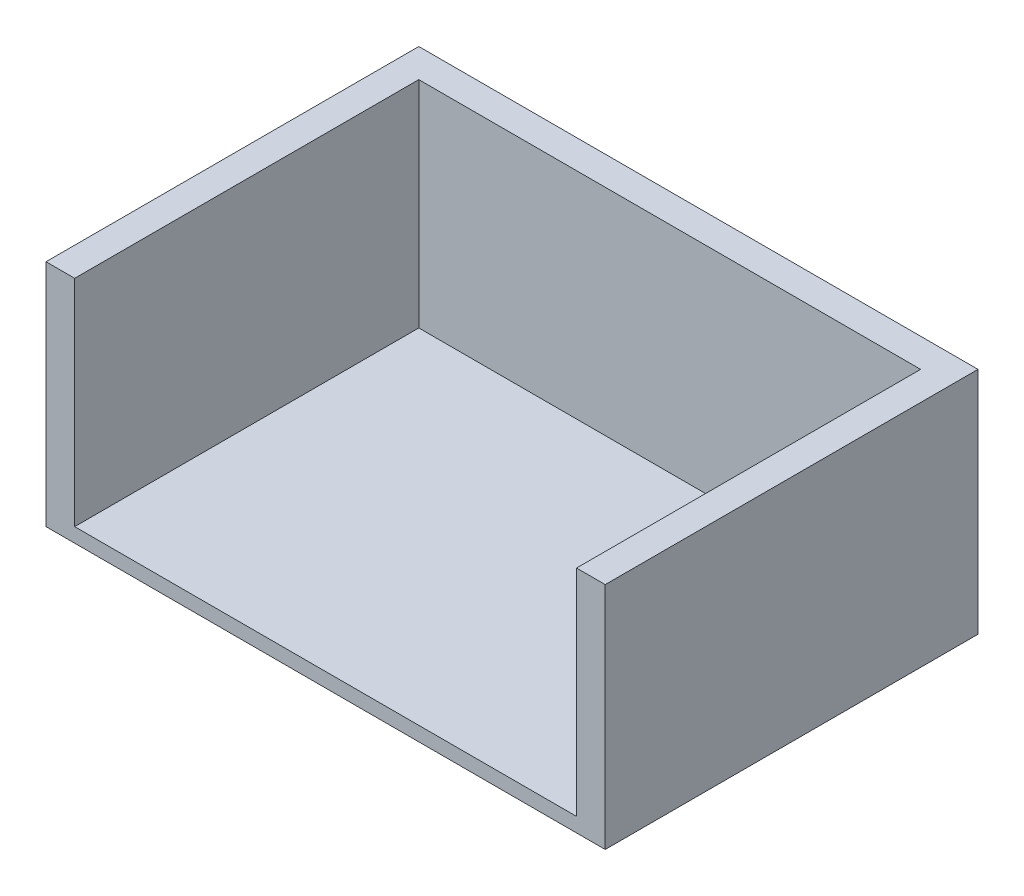
ISO-10303-21;
HEADER;
FILE_DESCRIPTION(('STEP AP214'),'2;1');
FILE_NAME('part.step','',(''),(''),'','','');
FILE_SCHEMA(('AUTOMOTIVE_DESIGN { 1 0 10303 214 1 1 1 1 }'));
ENDSEC;
DATA;
#1=APPLICATION_CONTEXT('core data for automotive mechanical design processes');
#2=APPLICATION_PROTOCOL_DEFINITION('international standard','automotive_design',2000,#1);
#3=PRODUCT_CONTEXT('',#1,'mechanical');
#4=PRODUCT('Part','Part','',(#3));
#5=PRODUCT_RELATED_PRODUCT_CATEGORY('part','',(#4));
#6=PRODUCT_DEFINITION_FORMATION('','',#4);
#7=PRODUCT_DEFINITION_CONTEXT('part definition',#1,'design');
#8=PRODUCT_DEFINITION('design','',#6,#7);
#9=PRODUCT_DEFINITION_SHAPE('','',#8);
#10=(LENGTH_UNIT() NAMED_UNIT(*) SI_UNIT(.MILLI.,.METRE.));
#11=(NAMED_UNIT(*) PLANE_ANGLE_UNIT() SI_UNIT($,.RADIAN.));
#12=(NAMED_UNIT(*) SI_UNIT($,.STERADIAN.) SOLID_ANGLE_UNIT());
#13=UNCERTAINTY_MEASURE_WITH_UNIT(LENGTH_MEASURE(1.E-05),#10,'distance_accuracy_value','');
#14=(GEOMETRIC_REPRESENTATION_CONTEXT(3) GLOBAL_UNCERTAINTY_ASSIGNED_CONTEXT((#13)) GLOBAL_UNIT_ASSIGNED_CONTEXT((#10,
#11,#12)) REPRESENTATION_CONTEXT('',''));
#15=CARTESIAN_POINT('',(0.,0.,0.));
#16=DIRECTION('',(0.,0.,1.));
#17=DIRECTION('',(1.,0.,0.));
#18=AXIS2_PLACEMENT_3D('',#15,#16,#17);
#19=CARTESIAN_POINT('',(175.,150.,0.));
#20=DIRECTION('',(1.,0.,0.));
#21=DIRECTION('',(0.,0.,-1.));
#22=AXIS2_PLACEMENT_3D('',#19,#20,#21);
#23=PLANE('',#22);
#24=DIRECTION('',(0.,0.,1.));
#25=VECTOR('',#24,1.);
#26=CARTESIAN_POINT('',(175.,0.,0.));
#27=LINE('',#26,#25);
#28=CARTESIAN_POINT('',(175.,0.,-120.));
#29=VERTEX_POINT('',#28);
#30=CARTESIAN_POINT('',(175.,0.,120.));
#31=VERTEX_POINT('',#30);
#32=EDGE_CURVE('E122',#29,#31,#27,.T.);
#33=ORIENTED_EDGE('',*,*,#32,.T.);
#34=DIRECTION('',(0.,-1.,0.));
#35=VECTOR('',#34,1.);
#36=CARTESIAN_POINT('',(175.,150.,120.));
#37=LINE('',#36,#35);
#38=CARTESIAN_POINT('',(175.,150.,120.));
#39=VERTEX_POINT('',#38);
#40=EDGE_CURVE('E11',#39,#31,#37,.T.);
#41=ORIENTED_EDGE('',*,*,#40,.F.);
#42=DIRECTION('',(0.,0.,1.));
#43=VECTOR('',#42,1.);
#44=CARTESIAN_POINT('',(175.,150.,0.));
#45=LINE('',#44,#43);
#46=CARTESIAN_POINT('',(175.,150.,-120.));
#47=VERTEX_POINT('',#46);
#48=EDGE_CURVE('E129',#47,#39,#45,.T.);
#49=ORIENTED_EDGE('',*,*,#48,.F.);
#50=DIRECTION('',(0.,-1.,0.));
#51=VECTOR('',#50,1.);
#52=CARTESIAN_POINT('',(175.,150.,-120.));
#53=LINE('',#52,#51);
#54=EDGE_CURVE('E118',#47,#29,#53,.T.);
#55=ORIENTED_EDGE('',*,*,#54,.T.);
#56=EDGE_LOOP('',(#33,#41,#49,#55));
#57=FACE_BOUND('',#56,.T.);
#58=ADVANCED_FACE('F39',(#57),#23,.F.);
#59=CARTESIAN_POINT('',(195.,150.,0.));
#60=DIRECTION('',(1.,0.,0.));
#61=DIRECTION('',(0.,0.,-1.));
#62=AXIS2_PLACEMENT_3D('',#59,#60,#61);
#63=PLANE('',#62);
#64=DIRECTION('',(0.,-1.,0.));
#65=VECTOR('',#64,1.);
#66=CARTESIAN_POINT('',(195.,150.,120.));
#67=LINE('',#66,#65);
#68=CARTESIAN_POINT('',(195.,150.,120.));
#69=VERTEX_POINT('',#68);
#70=CARTESIAN_POINT('',(195.,-10.,120.));
#71=VERTEX_POINT('',#70);
#72=EDGE_CURVE('E47',#69,#71,#67,.T.);
#73=ORIENTED_EDGE('',*,*,#72,.T.);
#74=DIRECTION('',(0.,0.,1.));
#75=VECTOR('',#74,1.);
#76=CARTESIAN_POINT('',(195.,-10.,0.));
#77=LINE('',#76,#75);
#78=CARTESIAN_POINT('',(195.,-10.,-140.));
#79=VERTEX_POINT('',#78);
#80=EDGE_CURVE('E146',#79,#71,#77,.T.);
#81=ORIENTED_EDGE('',*,*,#80,.F.);
#82=DIRECTION('',(0.,-1.,0.));
#83=VECTOR('',#82,1.);
#84=CARTESIAN_POINT('',(195.,150.,-140.));
#85=LINE('',#84,#83);
#86=CARTESIAN_POINT('',(195.,150.,-140.));
#87=VERTEX_POINT('',#86);
#88=EDGE_CURVE('E136',#87,#79,#85,.T.);
#89=ORIENTED_EDGE('',*,*,#88,.F.);
#90=DIRECTION('',(0.,0.,1.));
#91=VECTOR('',#90,1.);
#92=CARTESIAN_POINT('',(195.,150.,0.));
#93=LINE('',#92,#91);
#94=EDGE_CURVE('E148',#87,#69,#93,.T.);
#95=ORIENTED_EDGE('',*,*,#94,.T.);
#96=EDGE_LOOP('',(#73,#81,#89,#95));
#97=FACE_BOUND('',#96,.T.);
#98=ADVANCED_FACE('F144',(#97),#63,.T.);
#99=CARTESIAN_POINT('',(0.,150.,-140.));
#100=DIRECTION('',(0.,0.,-1.));
#101=DIRECTION('',(-1.,0.,0.));
#102=AXIS2_PLACEMENT_3D('',#99,#100,#101);
#103=PLANE('',#102);
#104=ORIENTED_EDGE('',*,*,#88,.T.);
#105=DIRECTION('',(1.,0.,0.));
#106=VECTOR('',#105,1.);
#107=CARTESIAN_POINT('',(0.,-10.,-140.));
#108=LINE('',#107,#106);
#109=CARTESIAN_POINT('',(-195.,-10.,-140.));
#110=VERTEX_POINT('',#109);
#111=EDGE_CURVE('E160',#110,#79,#108,.T.);
#112=ORIENTED_EDGE('',*,*,#111,.F.);
#113=DIRECTION('',(0.,-1.,0.));
#114=VECTOR('',#113,1.);
#115=CARTESIAN_POINT('',(-195.,150.,-140.));
#116=LINE('',#115,#114);
#117=CARTESIAN_POINT('',(-195.,150.,-140.));
#118=VERTEX_POINT('',#117);
#119=EDGE_CURVE('E133',#118,#110,#116,.T.);
#120=ORIENTED_EDGE('',*,*,#119,.F.);
#121=DIRECTION('',(1.,0.,0.));
#122=VECTOR('',#121,1.);
#123=CARTESIAN_POINT('',(0.,150.,-140.));
#124=LINE('',#123,#122);
#125=EDGE_CURVE('E170',#118,#87,#124,.T.);
#126=ORIENTED_EDGE('',*,*,#125,.T.);
#127=EDGE_LOOP('',(#104,#112,#120,#126));
#128=FACE_BOUND('',#127,.T.);
#129=ADVANCED_FACE('F173',(#128),#103,.T.);
#130=CARTESIAN_POINT('',(-195.,150.,0.));
#131=DIRECTION('',(1.,0.,0.));
#132=DIRECTION('',(0.,0.,-1.));
#133=AXIS2_PLACEMENT_3D('',#130,#131,#132);
#134=PLANE('',#133);
#135=ORIENTED_EDGE('',*,*,#119,.T.);
#136=DIRECTION('',(0.,0.,1.));
#137=VECTOR('',#136,1.);
#138=CARTESIAN_POINT('',(-195.,-10.,0.));
#139=LINE('',#138,#137);
#140=CARTESIAN_POINT('',(-195.,-10.,120.));
#141=VERTEX_POINT('',#140);
#142=EDGE_CURVE('E126',#110,#141,#139,.T.);
#143=ORIENTED_EDGE('',*,*,#142,.T.);
#144=DIRECTION('',(0.,-1.,0.));
#145=VECTOR('',#144,1.);
#146=CARTESIAN_POINT('',(-195.,150.,120.));
#147=LINE('',#146,#145);
#148=CARTESIAN_POINT('',(-195.,150.,120.));
#149=VERTEX_POINT('',#148);
#150=EDGE_CURVE('E107',#149,#141,#147,.T.);
#151=ORIENTED_EDGE('',*,*,#150,.F.);
#152=DIRECTION('',(0.,0.,1.));
#153=VECTOR('',#152,1.);
#154=CARTESIAN_POINT('',(-195.,150.,0.));
#155=LINE('',#154,#153);
#156=EDGE_CURVE('E113',#118,#149,#155,.T.);
#157=ORIENTED_EDGE('',*,*,#156,.F.);
#158=EDGE_LOOP('',(#135,#143,#151,#157));
#159=FACE_BOUND('',#158,.T.);
#160=ADVANCED_FACE('F184',(#159),#134,.F.);
#161=CARTESIAN_POINT('',(0.,150.,120.));
#162=DIRECTION('',(0.,0.,1.));
#163=DIRECTION('',(1.,0.,0.));
#164=AXIS2_PLACEMENT_3D('',#161,#162,#163);
#165=PLANE('',#164);
#166=ORIENTED_EDGE('',*,*,#150,.T.);
#167=DIRECTION('',(1.,0.,0.));
#168=VECTOR('',#167,1.);
#169=CARTESIAN_POINT('',(0.,-10.,120.));
#170=LINE('',#169,#168);
#171=EDGE_CURVE('E157',#141,#71,#170,.T.);
#172=ORIENTED_EDGE('',*,*,#171,.T.);
#173=ORIENTED_EDGE('',*,*,#72,.F.);
#174=DIRECTION('',(1.,0.,0.));
#175=VECTOR('',#174,1.);
#176=CARTESIAN_POINT('',(0.,150.,120.));
#177=LINE('',#176,#175);
#178=EDGE_CURVE('E80',#39,#69,#177,.T.);
#179=ORIENTED_EDGE('',*,*,#178,.F.);
#180=ORIENTED_EDGE('',*,*,#40,.T.);
#181=DIRECTION('',(1.,0.,0.));
#182=VECTOR('',#181,1.);
#183=CARTESIAN_POINT('',(0.,0.,120.));
#184=LINE('',#183,#182);
#185=CARTESIAN_POINT('',(-175.,0.,120.));
#186=VERTEX_POINT('',#185);
#187=EDGE_CURVE('E103',#186,#31,#184,.T.);
#188=ORIENTED_EDGE('',*,*,#187,.F.);
#189=DIRECTION('',(0.,-1.,0.));
#190=VECTOR('',#189,1.);
#191=CARTESIAN_POINT('',(-175.,150.,120.));
#192=LINE('',#191,#190);
#193=CARTESIAN_POINT('',(-175.,150.,120.));
#194=VERTEX_POINT('',#193);
#195=EDGE_CURVE('E97',#194,#186,#192,.T.);
#196=ORIENTED_EDGE('',*,*,#195,.F.);
#197=DIRECTION('',(-1.,0.,0.));
#198=VECTOR('',#197,1.);
#199=CARTESIAN_POINT('',(0.,150.,120.));
#200=LINE('',#199,#198);
#201=EDGE_CURVE('E101',#194,#149,#200,.T.);
#202=ORIENTED_EDGE('',*,*,#201,.T.);
#203=EDGE_LOOP('',(#166,#172,#173,#179,#180,#188,#196,#202));
#204=FACE_BOUND('',#203,.T.);
#205=ADVANCED_FACE('F100',(#204),#165,.T.);
#206=CARTESIAN_POINT('',(-175.,150.,0.));
#207=DIRECTION('',(1.,0.,0.));
#208=DIRECTION('',(0.,0.,-1.));
#209=AXIS2_PLACEMENT_3D('',#206,#207,#208);
#210=PLANE('',#209);
#211=DIRECTION('',(0.,0.,1.));
#212=VECTOR('',#211,1.);
#213=CARTESIAN_POINT('',(-175.,0.,0.));
#214=LINE('',#213,#212);
#215=CARTESIAN_POINT('',(-175.,0.,-120.));
#216=VERTEX_POINT('',#215);
#217=EDGE_CURVE('E125',#216,#186,#214,.T.);
#218=ORIENTED_EDGE('',*,*,#217,.F.);
#219=DIRECTION('',(0.,-1.,0.));
#220=VECTOR('',#219,1.);
#221=CARTESIAN_POINT('',(-175.,150.,-120.));
#222=LINE('',#221,#220);
#223=CARTESIAN_POINT('',(-175.,150.,-120.));
#224=VERTEX_POINT('',#223);
#225=EDGE_CURVE('E68',#224,#216,#222,.T.);
#226=ORIENTED_EDGE('',*,*,#225,.F.);
#227=DIRECTION('',(0.,0.,1.));
#228=VECTOR('',#227,1.);
#229=CARTESIAN_POINT('',(-175.,150.,0.));
#230=LINE('',#229,#228);
#231=EDGE_CURVE('E110',#224,#194,#230,.T.);
#232=ORIENTED_EDGE('',*,*,#231,.T.);
#233=ORIENTED_EDGE('',*,*,#195,.T.);
#234=EDGE_LOOP('',(#218,#226,#232,#233));
#235=FACE_BOUND('',#234,.T.);
#236=ADVANCED_FACE('F116',(#235),#210,.T.);
#237=CARTESIAN_POINT('',(0.,150.,-120.));
#238=DIRECTION('',(0.,0.,-1.));
#239=DIRECTION('',(-1.,0.,0.));
#240=AXIS2_PLACEMENT_3D('',#237,#238,#239);
#241=PLANE('',#240);
#242=DIRECTION('',(1.,0.,0.));
#243=VECTOR('',#242,1.);
#244=CARTESIAN_POINT('',(0.,0.,-120.));
#245=LINE('',#244,#243);
#246=EDGE_CURVE('E72',#216,#29,#245,.T.);
#247=ORIENTED_EDGE('',*,*,#246,.T.);
#248=ORIENTED_EDGE('',*,*,#54,.F.);
#249=DIRECTION('',(1.,0.,0.));
#250=VECTOR('',#249,1.);
#251=CARTESIAN_POINT('',(0.,150.,-120.));
#252=LINE('',#251,#250);
#253=EDGE_CURVE('E55',#224,#47,#252,.T.);
#254=ORIENTED_EDGE('',*,*,#253,.F.);
#255=ORIENTED_EDGE('',*,*,#225,.T.);
#256=EDGE_LOOP('',(#247,#248,#254,#255));
#257=FACE_BOUND('',#256,.T.);
#258=ADVANCED_FACE('F227',(#257),#241,.F.);
#259=CARTESIAN_POINT('',(0.,150.,0.));
#260=DIRECTION('',(0.,1.,0.));
#261=DIRECTION('',(0.,0.,1.));
#262=AXIS2_PLACEMENT_3D('',#259,#260,#261);
#263=PLANE('',#262);
#264=ORIENTED_EDGE('',*,*,#48,.T.);
#265=ORIENTED_EDGE('',*,*,#178,.T.);
#266=ORIENTED_EDGE('',*,*,#94,.F.);
#267=ORIENTED_EDGE('',*,*,#125,.F.);
#268=ORIENTED_EDGE('',*,*,#156,.T.);
#269=ORIENTED_EDGE('',*,*,#201,.F.);
#270=ORIENTED_EDGE('',*,*,#231,.F.);
#271=ORIENTED_EDGE('',*,*,#253,.T.);
#272=EDGE_LOOP('',(#264,#265,#266,#267,#268,#269,#270,#271));
#273=FACE_BOUND('',#272,.T.);
#274=ADVANCED_FACE('F109',(#273),#263,.T.);
#275=CARTESIAN_POINT('',(0.,0.,0.));
#276=DIRECTION('',(0.,1.,0.));
#277=DIRECTION('',(0.,0.,1.));
#278=AXIS2_PLACEMENT_3D('',#275,#276,#277);
#279=PLANE('',#278);
#280=ORIENTED_EDGE('',*,*,#32,.F.);
#281=ORIENTED_EDGE('',*,*,#246,.F.);
#282=ORIENTED_EDGE('',*,*,#217,.T.);
#283=ORIENTED_EDGE('',*,*,#187,.T.);
#284=EDGE_LOOP('',(#280,#281,#282,#283));
#285=FACE_BOUND('',#284,.T.);
#286=ADVANCED_FACE('F179',(#285),#279,.T.);
#287=CARTESIAN_POINT('',(0.,-10.,0.));
#288=DIRECTION('',(0.,1.,0.));
#289=DIRECTION('',(0.,0.,1.));
#290=AXIS2_PLACEMENT_3D('',#287,#288,#289);
#291=PLANE('',#290);
#292=ORIENTED_EDGE('',*,*,#171,.F.);
#293=ORIENTED_EDGE('',*,*,#142,.F.);
#294=ORIENTED_EDGE('',*,*,#111,.T.);
#295=ORIENTED_EDGE('',*,*,#80,.T.);
#296=EDGE_LOOP('',(#292,#293,#294,#295));
#297=FACE_BOUND('',#296,.T.);
#298=ADVANCED_FACE('F154',(#297),#291,.F.);
#299=CLOSED_SHELL('',(#58,#98,#129,#160,#205,#236,#258,#274,#286,#298));
#300=MANIFOLD_SOLID_BREP('B2',#299);
#301=ADVANCED_BREP_SHAPE_REPRESENTATION('',(#18,#300),#14);
#302=SHAPE_DEFINITION_REPRESENTATION(#9,#301);
ENDSEC;
END-ISO-10303-21;
